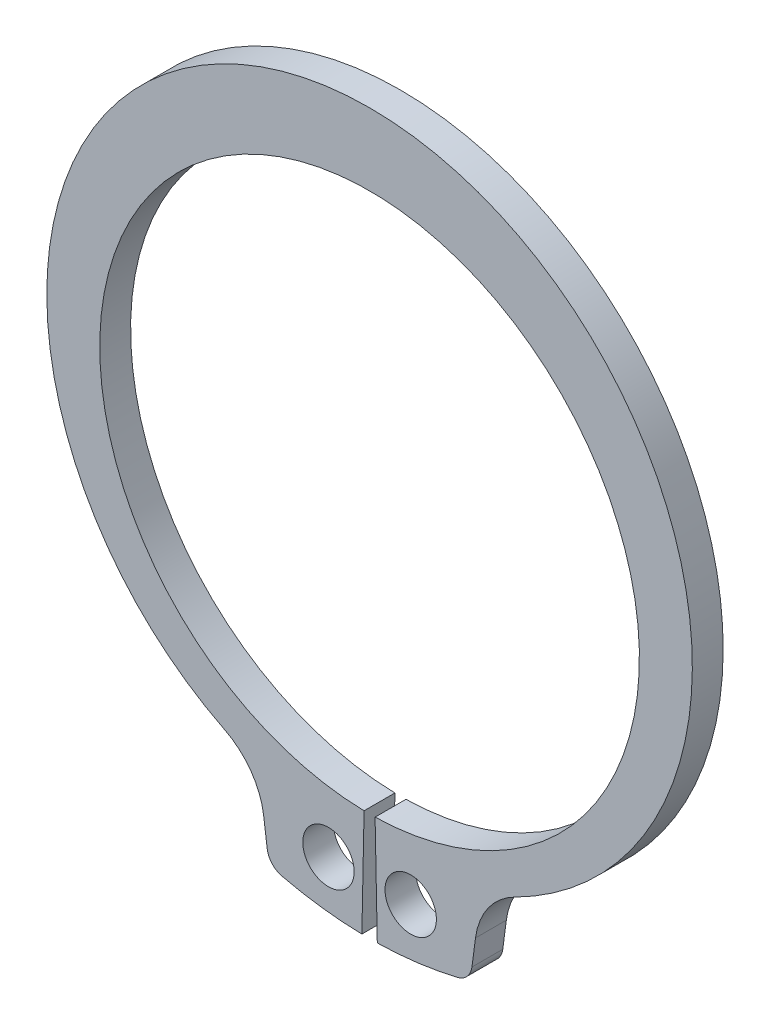
ISO-10303-21;
HEADER;
FILE_DESCRIPTION(('STEP AP214'),'2;1');
FILE_NAME('part.step','',(''),(''),'','','');
FILE_SCHEMA(('AUTOMOTIVE_DESIGN { 1 0 10303 214 1 1 1 1 }'));
ENDSEC;
DATA;
#1=APPLICATION_CONTEXT('core data for automotive mechanical design processes');
#2=APPLICATION_PROTOCOL_DEFINITION('international standard','automotive_design',2000,#1);
#3=PRODUCT_CONTEXT('',#1,'mechanical');
#4=PRODUCT('Part','Part','',(#3));
#5=PRODUCT_RELATED_PRODUCT_CATEGORY('part','',(#4));
#6=PRODUCT_DEFINITION_FORMATION('','',#4);
#7=PRODUCT_DEFINITION_CONTEXT('part definition',#1,'design');
#8=PRODUCT_DEFINITION('design','',#6,#7);
#9=PRODUCT_DEFINITION_SHAPE('','',#8);
#10=(LENGTH_UNIT() NAMED_UNIT(*) SI_UNIT(.MILLI.,.METRE.));
#11=(NAMED_UNIT(*) PLANE_ANGLE_UNIT() SI_UNIT($,.RADIAN.));
#12=(NAMED_UNIT(*) SI_UNIT($,.STERADIAN.) SOLID_ANGLE_UNIT());
#13=UNCERTAINTY_MEASURE_WITH_UNIT(LENGTH_MEASURE(1.E-05),#10,'distance_accuracy_value','');
#14=(GEOMETRIC_REPRESENTATION_CONTEXT(3) GLOBAL_UNCERTAINTY_ASSIGNED_CONTEXT((#13)) GLOBAL_UNIT_ASSIGNED_CONTEXT((#10,
#11,#12)) REPRESENTATION_CONTEXT('',''));
#15=CARTESIAN_POINT('',(0.,0.,0.));
#16=DIRECTION('',(0.,0.,1.));
#17=DIRECTION('',(1.,0.,0.));
#18=AXIS2_PLACEMENT_3D('',#15,#16,#17);
#19=CARTESIAN_POINT('',(0.,0.,-1.2));
#20=DIRECTION('',(0.,0.,1.));
#21=DIRECTION('',(1.,0.,0.));
#22=AXIS2_PLACEMENT_3D('',#19,#20,#21);
#23=CYLINDRICAL_SURFACE('',#22,10.5);
#24=CARTESIAN_POINT('',(0.,0.,0.));
#25=DIRECTION('',(0.,0.,-1.));
#26=DIRECTION('',(1.,0.,0.));
#27=AXIS2_PLACEMENT_3D('',#24,#25,#26);
#28=CIRCLE('',#27,10.5);
#29=CARTESIAN_POINT('',(-0.214285714285714,-10.4978131833565,0.));
#30=VERTEX_POINT('',#29);
#31=CARTESIAN_POINT('',(0.214285714285714,-10.4978131833565,0.));
#32=VERTEX_POINT('',#31);
#33=EDGE_CURVE('E154',#30,#32,#28,.T.);
#34=ORIENTED_EDGE('',*,*,#33,.F.);
#35=DIRECTION('',(0.,0.,1.));
#36=VECTOR('',#35,1.);
#37=CARTESIAN_POINT('',(-0.214285714285714,-10.4978131833565,-1.2));
#38=LINE('',#37,#36);
#39=CARTESIAN_POINT('',(-0.214285714285714,-10.4978131833565,-1.2));
#40=VERTEX_POINT('',#39);
#41=EDGE_CURVE('E11',#40,#30,#38,.T.);
#42=ORIENTED_EDGE('',*,*,#41,.F.);
#43=CARTESIAN_POINT('',(0.,0.,-1.2));
#44=DIRECTION('',(0.,0.,-1.));
#45=DIRECTION('',(1.,0.,0.));
#46=AXIS2_PLACEMENT_3D('',#43,#44,#45);
#47=CIRCLE('',#46,10.5);
#48=CARTESIAN_POINT('',(0.214285714285714,-10.4978131833565,-1.2));
#49=VERTEX_POINT('',#48);
#50=EDGE_CURVE('E187',#40,#49,#47,.T.);
#51=ORIENTED_EDGE('',*,*,#50,.T.);
#52=DIRECTION('',(0.,0.,1.));
#53=VECTOR('',#52,1.);
#54=CARTESIAN_POINT('',(0.214285714285714,-10.4978131833565,-1.2));
#55=LINE('',#54,#53);
#56=EDGE_CURVE('E36',#49,#32,#55,.T.);
#57=ORIENTED_EDGE('',*,*,#56,.T.);
#58=EDGE_LOOP('',(#34,#42,#51,#57));
#59=FACE_BOUND('',#58,.T.);
#60=ADVANCED_FACE('F33',(#59),#23,.F.);
#61=CARTESIAN_POINT('',(-0.214285714285714,-10.4978131833565,-1.2));
#62=DIRECTION('',(0.999791731748236,-0.0204081632653061,0.));
#63=DIRECTION('',(0.0204081632653061,0.999791731748236,0.));
#64=AXIS2_PLACEMENT_3D('',#61,#62,#63);
#65=PLANE('',#64);
#66=DIRECTION('',(0.0204081632653061,0.999791731748236,0.));
#67=VECTOR('',#66,1.);
#68=CARTESIAN_POINT('',(-0.214285714285714,-10.4978131833565,0.));
#69=LINE('',#68,#67);
#70=CARTESIAN_POINT('',(-0.3,-14.6969384566991,0.));
#71=VERTEX_POINT('',#70);
#72=EDGE_CURVE('E185',#71,#30,#69,.T.);
#73=ORIENTED_EDGE('',*,*,#72,.F.);
#74=DIRECTION('',(0.,0.,1.));
#75=VECTOR('',#74,1.);
#76=CARTESIAN_POINT('',(-0.3,-14.6969384566991,-1.2));
#77=LINE('',#76,#75);
#78=CARTESIAN_POINT('',(-0.3,-14.6969384566991,-1.2));
#79=VERTEX_POINT('',#78);
#80=EDGE_CURVE('E42',#79,#71,#77,.T.);
#81=ORIENTED_EDGE('',*,*,#80,.F.);
#82=DIRECTION('',(0.0204081632653061,0.999791731748236,0.));
#83=VECTOR('',#82,1.);
#84=CARTESIAN_POINT('',(-0.214285714285714,-10.4978131833565,-1.2));
#85=LINE('',#84,#83);
#86=EDGE_CURVE('E144',#79,#40,#85,.T.);
#87=ORIENTED_EDGE('',*,*,#86,.T.);
#88=ORIENTED_EDGE('',*,*,#41,.T.);
#89=EDGE_LOOP('',(#73,#81,#87,#88));
#90=FACE_BOUND('',#89,.T.);
#91=ADVANCED_FACE('F207',(#90),#65,.T.);
#92=CARTESIAN_POINT('',(0.,0.,-1.2));
#93=DIRECTION('',(0.,0.,1.));
#94=DIRECTION('',(1.,0.,0.));
#95=AXIS2_PLACEMENT_3D('',#92,#93,#94);
#96=CYLINDRICAL_SURFACE('',#95,14.7);
#97=CARTESIAN_POINT('',(0.,0.,0.));
#98=DIRECTION('',(0.,0.,1.));
#99=DIRECTION('',(1.,0.,0.));
#100=AXIS2_PLACEMENT_3D('',#97,#98,#99);
#101=CIRCLE('',#100,14.7);
#102=CARTESIAN_POINT('',(-3.41376560548655,-14.2981189109196,0.));
#103=VERTEX_POINT('',#102);
#104=EDGE_CURVE('E131',#103,#71,#101,.T.);
#105=ORIENTED_EDGE('',*,*,#104,.F.);
#106=DIRECTION('',(0.,0.,1.));
#107=VECTOR('',#106,1.);
#108=CARTESIAN_POINT('',(-3.41376560548655,-14.2981189109196,-1.2));
#109=LINE('',#108,#107);
#110=CARTESIAN_POINT('',(-3.41376560548655,-14.2981189109196,-1.2));
#111=VERTEX_POINT('',#110);
#112=EDGE_CURVE('E126',#111,#103,#109,.T.);
#113=ORIENTED_EDGE('',*,*,#112,.F.);
#114=CARTESIAN_POINT('',(0.,0.,-1.2));
#115=DIRECTION('',(0.,0.,1.));
#116=DIRECTION('',(1.,0.,0.));
#117=AXIS2_PLACEMENT_3D('',#114,#115,#116);
#118=CIRCLE('',#117,14.7);
#119=EDGE_CURVE('E129',#111,#79,#118,.T.);
#120=ORIENTED_EDGE('',*,*,#119,.T.);
#121=ORIENTED_EDGE('',*,*,#80,.T.);
#122=EDGE_LOOP('',(#105,#113,#120,#121));
#123=FACE_BOUND('',#122,.T.);
#124=ADVANCED_FACE('F128',(#123),#96,.T.);
#125=CARTESIAN_POINT('',(-3.23959389092091,-13.5686230481176,-1.2));
#126=DIRECTION('',(0.,0.,1.));
#127=DIRECTION('',(1.,0.,0.));
#128=AXIS2_PLACEMENT_3D('',#125,#126,#127);
#129=CYLINDRICAL_SURFACE('',#128,0.750000000000003);
#130=CARTESIAN_POINT('',(-3.23959389092091,-13.5686230481176,0.));
#131=DIRECTION('',(0.,0.,1.));
#132=DIRECTION('',(1.,0.,0.));
#133=AXIS2_PLACEMENT_3D('',#130,#131,#132);
#134=CIRCLE('',#133,0.750000000000003);
#135=CARTESIAN_POINT('',(-3.98317753695127,-13.6665176922826,0.));
#136=VERTEX_POINT('',#135);
#137=EDGE_CURVE('E182',#136,#103,#134,.T.);
#138=ORIENTED_EDGE('',*,*,#137,.F.);
#139=DIRECTION('',(0.,0.,1.));
#140=VECTOR('',#139,1.);
#141=CARTESIAN_POINT('',(-3.98317753695127,-13.6665176922826,-1.2));
#142=LINE('',#141,#140);
#143=CARTESIAN_POINT('',(-3.98317753695127,-13.6665176922826,-1.2));
#144=VERTEX_POINT('',#143);
#145=EDGE_CURVE('E136',#144,#136,#142,.T.);
#146=ORIENTED_EDGE('',*,*,#145,.F.);
#147=CARTESIAN_POINT('',(-3.23959389092091,-13.5686230481176,-1.2));
#148=DIRECTION('',(0.,0.,1.));
#149=DIRECTION('',(1.,0.,0.));
#150=AXIS2_PLACEMENT_3D('',#147,#148,#149);
#151=CIRCLE('',#150,0.750000000000003);
#152=EDGE_CURVE('E142',#144,#111,#151,.T.);
#153=ORIENTED_EDGE('',*,*,#152,.T.);
#154=ORIENTED_EDGE('',*,*,#112,.T.);
#155=EDGE_LOOP('',(#138,#146,#153,#154));
#156=FACE_BOUND('',#155,.T.);
#157=ADVANCED_FACE('F146',(#156),#129,.T.);
#158=CARTESIAN_POINT('',(-4.12142385822541,-12.6164326288954,-1.2));
#159=DIRECTION('',(-0.99144486137381,-0.130526192220054,0.));
#160=DIRECTION('',(0.130526192220054,-0.99144486137381,0.));
#161=AXIS2_PLACEMENT_3D('',#158,#159,#160);
#162=PLANE('',#161);
#163=DIRECTION('',(0.130526192220054,-0.99144486137381,0.));
#164=VECTOR('',#163,1.);
#165=CARTESIAN_POINT('',(-4.12142385822541,-12.6164326288954,0.));
#166=LINE('',#165,#164);
#167=CARTESIAN_POINT('',(-4.12142385822541,-12.6164326288954,0.));
#168=VERTEX_POINT('',#167);
#169=EDGE_CURVE('E179',#168,#136,#166,.T.);
#170=ORIENTED_EDGE('',*,*,#169,.F.);
#171=DIRECTION('',(0.,0.,1.));
#172=VECTOR('',#171,1.);
#173=CARTESIAN_POINT('',(-4.12142385822541,-12.6164326288954,-1.2));
#174=LINE('',#173,#172);
#175=CARTESIAN_POINT('',(-4.12142385822541,-12.6164326288954,-1.2));
#176=VERTEX_POINT('',#175);
#177=EDGE_CURVE('E191',#176,#168,#174,.T.);
#178=ORIENTED_EDGE('',*,*,#177,.F.);
#179=DIRECTION('',(0.130526192220054,-0.99144486137381,0.));
#180=VECTOR('',#179,1.);
#181=CARTESIAN_POINT('',(-4.12142385822541,-12.6164326288954,-1.2));
#182=LINE('',#181,#180);
#183=EDGE_CURVE('E147',#176,#144,#182,.T.);
#184=ORIENTED_EDGE('',*,*,#183,.T.);
#185=ORIENTED_EDGE('',*,*,#145,.T.);
#186=EDGE_LOOP('',(#170,#178,#184,#185));
#187=FACE_BOUND('',#186,.T.);
#188=ADVANCED_FACE('F220',(#187),#162,.T.);
#189=CARTESIAN_POINT('',(-6.89659987863657,-12.9817914832272,-1.2));
#190=DIRECTION('',(0.,0.,1.));
#191=DIRECTION('',(1.,0.,0.));
#192=AXIS2_PLACEMENT_3D('',#189,#190,#191);
#193=CYLINDRICAL_SURFACE('',#192,2.79912290489427);
#194=CARTESIAN_POINT('',(-6.89659987863657,-12.9817914832272,0.));
#195=DIRECTION('',(0.,0.,-1.));
#196=DIRECTION('',(1.,0.,0.));
#197=AXIS2_PLACEMENT_3D('',#194,#195,#196);
#198=CIRCLE('',#197,2.79912290489427);
#199=CARTESIAN_POINT('',(-5.6396560613573,-10.4807554425218,0.));
#200=VERTEX_POINT('',#199);
#201=EDGE_CURVE('E176',#200,#168,#198,.T.);
#202=ORIENTED_EDGE('',*,*,#201,.F.);
#203=DIRECTION('',(0.,0.,1.));
#204=VECTOR('',#203,1.);
#205=CARTESIAN_POINT('',(-5.6396560613573,-10.4807554425218,-1.2));
#206=LINE('',#205,#204);
#207=CARTESIAN_POINT('',(-5.6396560613573,-10.4807554425218,-1.2));
#208=VERTEX_POINT('',#207);
#209=EDGE_CURVE('E193',#208,#200,#206,.T.);
#210=ORIENTED_EDGE('',*,*,#209,.F.);
#211=CARTESIAN_POINT('',(-6.89659987863657,-12.9817914832272,-1.2));
#212=DIRECTION('',(0.,0.,-1.));
#213=DIRECTION('',(1.,0.,0.));
#214=AXIS2_PLACEMENT_3D('',#211,#212,#213);
#215=CIRCLE('',#214,2.79912290489427);
#216=EDGE_CURVE('E149',#208,#176,#215,.T.);
#217=ORIENTED_EDGE('',*,*,#216,.T.);
#218=ORIENTED_EDGE('',*,*,#177,.T.);
#219=EDGE_LOOP('',(#202,#210,#217,#218));
#220=FACE_BOUND('',#219,.T.);
#221=ADVANCED_FACE('F223',(#220),#193,.F.);
#222=CARTESIAN_POINT('',(0.,0.740894143350816,-1.2));
#223=DIRECTION('',(0.,0.,1.));
#224=DIRECTION('',(1.,0.,0.));
#225=AXIS2_PLACEMENT_3D('',#222,#223,#224);
#226=CYLINDRICAL_SURFACE('',#225,12.5591058566492);
#227=CARTESIAN_POINT('',(0.,0.740894143350816,0.));
#228=DIRECTION('',(0.,0.,1.));
#229=DIRECTION('',(1.,0.,0.));
#230=AXIS2_PLACEMENT_3D('',#227,#228,#229);
#231=CIRCLE('',#230,12.5591058566492);
#232=CARTESIAN_POINT('',(5.63965606135729,-10.4807554425218,0.));
#233=VERTEX_POINT('',#232);
#234=EDGE_CURVE('E173',#233,#200,#231,.T.);
#235=ORIENTED_EDGE('',*,*,#234,.F.);
#236=DIRECTION('',(0.,0.,1.));
#237=VECTOR('',#236,1.);
#238=CARTESIAN_POINT('',(5.63965606135729,-10.4807554425218,-1.2));
#239=LINE('',#238,#237);
#240=CARTESIAN_POINT('',(5.63965606135729,-10.4807554425218,-1.2));
#241=VERTEX_POINT('',#240);
#242=EDGE_CURVE('E195',#241,#233,#239,.T.);
#243=ORIENTED_EDGE('',*,*,#242,.F.);
#244=CARTESIAN_POINT('',(0.,0.740894143350816,-1.2));
#245=DIRECTION('',(0.,0.,1.));
#246=DIRECTION('',(1.,0.,0.));
#247=AXIS2_PLACEMENT_3D('',#244,#245,#246);
#248=CIRCLE('',#247,12.5591058566492);
#249=EDGE_CURVE('E297',#241,#208,#248,.T.);
#250=ORIENTED_EDGE('',*,*,#249,.T.);
#251=ORIENTED_EDGE('',*,*,#209,.T.);
#252=EDGE_LOOP('',(#235,#243,#250,#251));
#253=FACE_BOUND('',#252,.T.);
#254=ADVANCED_FACE('F227',(#253),#226,.T.);
#255=CARTESIAN_POINT('',(6.89659987863657,-12.9817914832272,-1.2));
#256=DIRECTION('',(0.,0.,1.));
#257=DIRECTION('',(1.,0.,0.));
#258=AXIS2_PLACEMENT_3D('',#255,#256,#257);
#259=CYLINDRICAL_SURFACE('',#258,2.79912290489427);
#260=CARTESIAN_POINT('',(6.89659987863657,-12.9817914832272,0.));
#261=DIRECTION('',(0.,0.,-1.));
#262=DIRECTION('',(1.,0.,0.));
#263=AXIS2_PLACEMENT_3D('',#260,#261,#262);
#264=CIRCLE('',#263,2.79912290489427);
#265=CARTESIAN_POINT('',(4.12142385822541,-12.6164326288954,0.));
#266=VERTEX_POINT('',#265);
#267=EDGE_CURVE('E170',#266,#233,#264,.T.);
#268=ORIENTED_EDGE('',*,*,#267,.F.);
#269=DIRECTION('',(0.,0.,1.));
#270=VECTOR('',#269,1.);
#271=CARTESIAN_POINT('',(4.12142385822541,-12.6164326288954,-1.2));
#272=LINE('',#271,#270);
#273=CARTESIAN_POINT('',(4.12142385822541,-12.6164326288954,-1.2));
#274=VERTEX_POINT('',#273);
#275=EDGE_CURVE('E197',#274,#266,#272,.T.);
#276=ORIENTED_EDGE('',*,*,#275,.F.);
#277=CARTESIAN_POINT('',(6.89659987863657,-12.9817914832272,-1.2));
#278=DIRECTION('',(0.,0.,-1.));
#279=DIRECTION('',(1.,0.,0.));
#280=AXIS2_PLACEMENT_3D('',#277,#278,#279);
#281=CIRCLE('',#280,2.79912290489427);
#282=EDGE_CURVE('E294',#274,#241,#281,.T.);
#283=ORIENTED_EDGE('',*,*,#282,.T.);
#284=ORIENTED_EDGE('',*,*,#242,.T.);
#285=EDGE_LOOP('',(#268,#276,#283,#284));
#286=FACE_BOUND('',#285,.T.);
#287=ADVANCED_FACE('F231',(#286),#259,.F.);
#288=CARTESIAN_POINT('',(4.12142385822541,-12.6164326288954,-1.2));
#289=DIRECTION('',(0.99144486137381,-0.130526192220054,0.));
#290=DIRECTION('',(0.130526192220054,0.99144486137381,0.));
#291=AXIS2_PLACEMENT_3D('',#288,#289,#290);
#292=PLANE('',#291);
#293=DIRECTION('',(0.130526192220054,0.99144486137381,0.));
#294=VECTOR('',#293,1.);
#295=CARTESIAN_POINT('',(4.12142385822541,-12.6164326288954,0.));
#296=LINE('',#295,#294);
#297=CARTESIAN_POINT('',(3.98317753695126,-13.6665176922826,0.));
#298=VERTEX_POINT('',#297);
#299=EDGE_CURVE('E167',#298,#266,#296,.T.);
#300=ORIENTED_EDGE('',*,*,#299,.F.);
#301=DIRECTION('',(0.,0.,1.));
#302=VECTOR('',#301,1.);
#303=CARTESIAN_POINT('',(3.98317753695126,-13.6665176922826,-1.2));
#304=LINE('',#303,#302);
#305=CARTESIAN_POINT('',(3.98317753695126,-13.6665176922826,-1.2));
#306=VERTEX_POINT('',#305);
#307=EDGE_CURVE('E199',#306,#298,#304,.T.);
#308=ORIENTED_EDGE('',*,*,#307,.F.);
#309=DIRECTION('',(0.130526192220054,0.99144486137381,0.));
#310=VECTOR('',#309,1.);
#311=CARTESIAN_POINT('',(4.12142385822541,-12.6164326288954,-1.2));
#312=LINE('',#311,#310);
#313=EDGE_CURVE('E291',#306,#274,#312,.T.);
#314=ORIENTED_EDGE('',*,*,#313,.T.);
#315=ORIENTED_EDGE('',*,*,#275,.T.);
#316=EDGE_LOOP('',(#300,#308,#314,#315));
#317=FACE_BOUND('',#316,.T.);
#318=ADVANCED_FACE('F235',(#317),#292,.T.);
#319=CARTESIAN_POINT('',(3.23959389092091,-13.5686230481176,-1.2));
#320=DIRECTION('',(0.,0.,1.));
#321=DIRECTION('',(1.,0.,0.));
#322=AXIS2_PLACEMENT_3D('',#319,#320,#321);
#323=CYLINDRICAL_SURFACE('',#322,0.750000000000003);
#324=CARTESIAN_POINT('',(3.23959389092091,-13.5686230481176,0.));
#325=DIRECTION('',(0.,0.,1.));
#326=DIRECTION('',(-1.,0.,0.));
#327=AXIS2_PLACEMENT_3D('',#324,#325,#326);
#328=CIRCLE('',#327,0.750000000000003);
#329=CARTESIAN_POINT('',(3.41376560548655,-14.2981189109196,0.));
#330=VERTEX_POINT('',#329);
#331=EDGE_CURVE('E164',#330,#298,#328,.T.);
#332=ORIENTED_EDGE('',*,*,#331,.F.);
#333=DIRECTION('',(0.,0.,1.));
#334=VECTOR('',#333,1.);
#335=CARTESIAN_POINT('',(3.41376560548655,-14.2981189109196,-1.2));
#336=LINE('',#335,#334);
#337=CARTESIAN_POINT('',(3.41376560548655,-14.2981189109196,-1.2));
#338=VERTEX_POINT('',#337);
#339=EDGE_CURVE('E201',#338,#330,#336,.T.);
#340=ORIENTED_EDGE('',*,*,#339,.F.);
#341=CARTESIAN_POINT('',(3.23959389092091,-13.5686230481176,-1.2));
#342=DIRECTION('',(0.,0.,1.));
#343=DIRECTION('',(-1.,0.,0.));
#344=AXIS2_PLACEMENT_3D('',#341,#342,#343);
#345=CIRCLE('',#344,0.750000000000003);
#346=EDGE_CURVE('E288',#338,#306,#345,.T.);
#347=ORIENTED_EDGE('',*,*,#346,.T.);
#348=ORIENTED_EDGE('',*,*,#307,.T.);
#349=EDGE_LOOP('',(#332,#340,#347,#348));
#350=FACE_BOUND('',#349,.T.);
#351=ADVANCED_FACE('F239',(#350),#323,.T.);
#352=CARTESIAN_POINT('',(0.,0.,-1.2));
#353=DIRECTION('',(0.,0.,1.));
#354=DIRECTION('',(1.,0.,0.));
#355=AXIS2_PLACEMENT_3D('',#352,#353,#354);
#356=CYLINDRICAL_SURFACE('',#355,14.7);
#357=CARTESIAN_POINT('',(0.,0.,0.));
#358=DIRECTION('',(0.,0.,1.));
#359=DIRECTION('',(1.,0.,0.));
#360=AXIS2_PLACEMENT_3D('',#357,#358,#359);
#361=CIRCLE('',#360,14.7);
#362=CARTESIAN_POINT('',(0.300000000000003,-14.6969384566991,0.));
#363=VERTEX_POINT('',#362);
#364=EDGE_CURVE('E161',#363,#330,#361,.T.);
#365=ORIENTED_EDGE('',*,*,#364,.F.);
#366=DIRECTION('',(0.,0.,1.));
#367=VECTOR('',#366,1.);
#368=CARTESIAN_POINT('',(0.300000000000003,-14.6969384566991,-1.2));
#369=LINE('',#368,#367);
#370=CARTESIAN_POINT('',(0.300000000000003,-14.6969384566991,-1.2));
#371=VERTEX_POINT('',#370);
#372=EDGE_CURVE('E202',#371,#363,#369,.T.);
#373=ORIENTED_EDGE('',*,*,#372,.F.);
#374=CARTESIAN_POINT('',(0.,0.,-1.2));
#375=DIRECTION('',(0.,0.,1.));
#376=DIRECTION('',(1.,0.,0.));
#377=AXIS2_PLACEMENT_3D('',#374,#375,#376);
#378=CIRCLE('',#377,14.7);
#379=EDGE_CURVE('E285',#371,#338,#378,.T.);
#380=ORIENTED_EDGE('',*,*,#379,.T.);
#381=ORIENTED_EDGE('',*,*,#339,.T.);
#382=EDGE_LOOP('',(#365,#373,#380,#381));
#383=FACE_BOUND('',#382,.T.);
#384=ADVANCED_FACE('F243',(#383),#356,.T.);
#385=CARTESIAN_POINT('',(0.214285714285714,-10.4978131833565,-1.2));
#386=DIRECTION('',(-0.999791731748236,-0.0204081632653061,0.));
#387=DIRECTION('',(0.0204081632653061,-0.999791731748236,0.));
#388=AXIS2_PLACEMENT_3D('',#385,#386,#387);
#389=PLANE('',#388);
#390=DIRECTION('',(0.0204081632653061,-0.999791731748236,0.));
#391=VECTOR('',#390,1.);
#392=CARTESIAN_POINT('',(0.214285714285714,-10.4978131833565,0.));
#393=LINE('',#392,#391);
#394=EDGE_CURVE('E157',#32,#363,#393,.T.);
#395=ORIENTED_EDGE('',*,*,#394,.F.);
#396=ORIENTED_EDGE('',*,*,#56,.F.);
#397=DIRECTION('',(0.0204081632653061,-0.999791731748236,0.));
#398=VECTOR('',#397,1.);
#399=CARTESIAN_POINT('',(0.214285714285714,-10.4978131833565,-1.2));
#400=LINE('',#399,#398);
#401=EDGE_CURVE('E283',#49,#371,#400,.T.);
#402=ORIENTED_EDGE('',*,*,#401,.T.);
#403=ORIENTED_EDGE('',*,*,#372,.T.);
#404=EDGE_LOOP('',(#395,#396,#402,#403));
#405=FACE_BOUND('',#404,.T.);
#406=ADVANCED_FACE('F204',(#405),#389,.T.);
#407=CARTESIAN_POINT('',(0.,0.,-1.2));
#408=DIRECTION('',(0.,0.,1.));
#409=DIRECTION('',(1.,0.,0.));
#410=AXIS2_PLACEMENT_3D('',#407,#408,#409);
#411=PLANE('',#410);
#412=CARTESIAN_POINT('',(-1.6,-12.75,-1.2));
#413=DIRECTION('',(0.,0.,1.));
#414=DIRECTION('',(1.,0.,0.));
#415=AXIS2_PLACEMENT_3D('',#412,#413,#414);
#416=CIRCLE('',#415,1.);
#417=CARTESIAN_POINT('',(-0.6,-12.75,-1.2));
#418=VERTEX_POINT('',#417);
#419=EDGE_CURVE('E270',#418,#418,#416,.T.);
#420=ORIENTED_EDGE('',*,*,#419,.T.);
#421=EDGE_LOOP('',(#420));
#422=FACE_BOUND('',#421,.T.);
#423=CARTESIAN_POINT('',(1.6,-12.75,-1.2));
#424=DIRECTION('',(0.,0.,1.));
#425=DIRECTION('',(1.,0.,0.));
#426=AXIS2_PLACEMENT_3D('',#423,#424,#425);
#427=CIRCLE('',#426,1.);
#428=CARTESIAN_POINT('',(2.6,-12.75,-1.2));
#429=VERTEX_POINT('',#428);
#430=EDGE_CURVE('E158',#429,#429,#427,.T.);
#431=ORIENTED_EDGE('',*,*,#430,.T.);
#432=EDGE_LOOP('',(#431));
#433=FACE_BOUND('',#432,.T.);
#434=ORIENTED_EDGE('',*,*,#50,.F.);
#435=ORIENTED_EDGE('',*,*,#86,.F.);
#436=ORIENTED_EDGE('',*,*,#119,.F.);
#437=ORIENTED_EDGE('',*,*,#152,.F.);
#438=ORIENTED_EDGE('',*,*,#183,.F.);
#439=ORIENTED_EDGE('',*,*,#216,.F.);
#440=ORIENTED_EDGE('',*,*,#249,.F.);
#441=ORIENTED_EDGE('',*,*,#282,.F.);
#442=ORIENTED_EDGE('',*,*,#313,.F.);
#443=ORIENTED_EDGE('',*,*,#346,.F.);
#444=ORIENTED_EDGE('',*,*,#379,.F.);
#445=ORIENTED_EDGE('',*,*,#401,.F.);
#446=EDGE_LOOP('',(#434,#435,#436,#437,#438,#439,#440,#441,#442,#443,#444,#445));
#447=FACE_BOUND('',#446,.T.);
#448=ADVANCED_FACE('F140',(#422,#433,#447),#411,.F.);
#449=CARTESIAN_POINT('',(0.,0.,0.));
#450=DIRECTION('',(0.,0.,1.));
#451=DIRECTION('',(1.,0.,0.));
#452=AXIS2_PLACEMENT_3D('',#449,#450,#451);
#453=PLANE('',#452);
#454=CARTESIAN_POINT('',(-1.6,-12.75,0.));
#455=DIRECTION('',(0.,0.,1.));
#456=DIRECTION('',(1.,0.,0.));
#457=AXIS2_PLACEMENT_3D('',#454,#455,#456);
#458=CIRCLE('',#457,1.);
#459=CARTESIAN_POINT('',(-0.6,-12.75,0.));
#460=VERTEX_POINT('',#459);
#461=EDGE_CURVE('E273',#460,#460,#458,.T.);
#462=ORIENTED_EDGE('',*,*,#461,.F.);
#463=EDGE_LOOP('',(#462));
#464=FACE_BOUND('',#463,.T.);
#465=CARTESIAN_POINT('',(1.6,-12.75,0.));
#466=DIRECTION('',(0.,0.,1.));
#467=DIRECTION('',(1.,0.,0.));
#468=AXIS2_PLACEMENT_3D('',#465,#466,#467);
#469=CIRCLE('',#468,1.);
#470=CARTESIAN_POINT('',(2.6,-12.75,0.));
#471=VERTEX_POINT('',#470);
#472=EDGE_CURVE('E275',#471,#471,#469,.T.);
#473=ORIENTED_EDGE('',*,*,#472,.F.);
#474=EDGE_LOOP('',(#473));
#475=FACE_BOUND('',#474,.T.);
#476=ORIENTED_EDGE('',*,*,#33,.T.);
#477=ORIENTED_EDGE('',*,*,#394,.T.);
#478=ORIENTED_EDGE('',*,*,#364,.T.);
#479=ORIENTED_EDGE('',*,*,#331,.T.);
#480=ORIENTED_EDGE('',*,*,#299,.T.);
#481=ORIENTED_EDGE('',*,*,#267,.T.);
#482=ORIENTED_EDGE('',*,*,#234,.T.);
#483=ORIENTED_EDGE('',*,*,#201,.T.);
#484=ORIENTED_EDGE('',*,*,#169,.T.);
#485=ORIENTED_EDGE('',*,*,#137,.T.);
#486=ORIENTED_EDGE('',*,*,#104,.T.);
#487=ORIENTED_EDGE('',*,*,#72,.T.);
#488=EDGE_LOOP('',(#476,#477,#478,#479,#480,#481,#482,#483,#484,#485,#486,#487));
#489=FACE_BOUND('',#488,.T.);
#490=ADVANCED_FACE('F206',(#464,#475,#489),#453,.T.);
#491=CARTESIAN_POINT('',(1.6,-12.75,-1.2));
#492=DIRECTION('',(0.,0.,1.));
#493=DIRECTION('',(1.,0.,0.));
#494=AXIS2_PLACEMENT_3D('',#491,#492,#493);
#495=CYLINDRICAL_SURFACE('',#494,1.);
#496=ORIENTED_EDGE('',*,*,#430,.F.);
#497=EDGE_LOOP('',(#496));
#498=FACE_BOUND('',#497,.T.);
#499=ORIENTED_EDGE('',*,*,#472,.T.);
#500=EDGE_LOOP('',(#499));
#501=FACE_BOUND('',#500,.T.);
#502=ADVANCED_FACE('F255',(#498,#501),#495,.F.);
#503=CARTESIAN_POINT('',(-1.6,-12.75,-1.2));
#504=DIRECTION('',(0.,0.,1.));
#505=DIRECTION('',(1.,0.,0.));
#506=AXIS2_PLACEMENT_3D('',#503,#504,#505);
#507=CYLINDRICAL_SURFACE('',#506,1.);
#508=ORIENTED_EDGE('',*,*,#419,.F.);
#509=EDGE_LOOP('',(#508));
#510=FACE_BOUND('',#509,.T.);
#511=ORIENTED_EDGE('',*,*,#461,.T.);
#512=EDGE_LOOP('',(#511));
#513=FACE_BOUND('',#512,.T.);
#514=ADVANCED_FACE('F262',(#510,#513),#507,.F.);
#515=CLOSED_SHELL('',(#60,#91,#124,#157,#188,#221,#254,#287,#318,#351,#384,#406,#448,#490,#502,#514));
#516=MANIFOLD_SOLID_BREP('B2',#515);
#517=ADVANCED_BREP_SHAPE_REPRESENTATION('',(#18,#516),#14);
#518=SHAPE_DEFINITION_REPRESENTATION(#9,#517);
ENDSEC;
END-ISO-10303-21;
